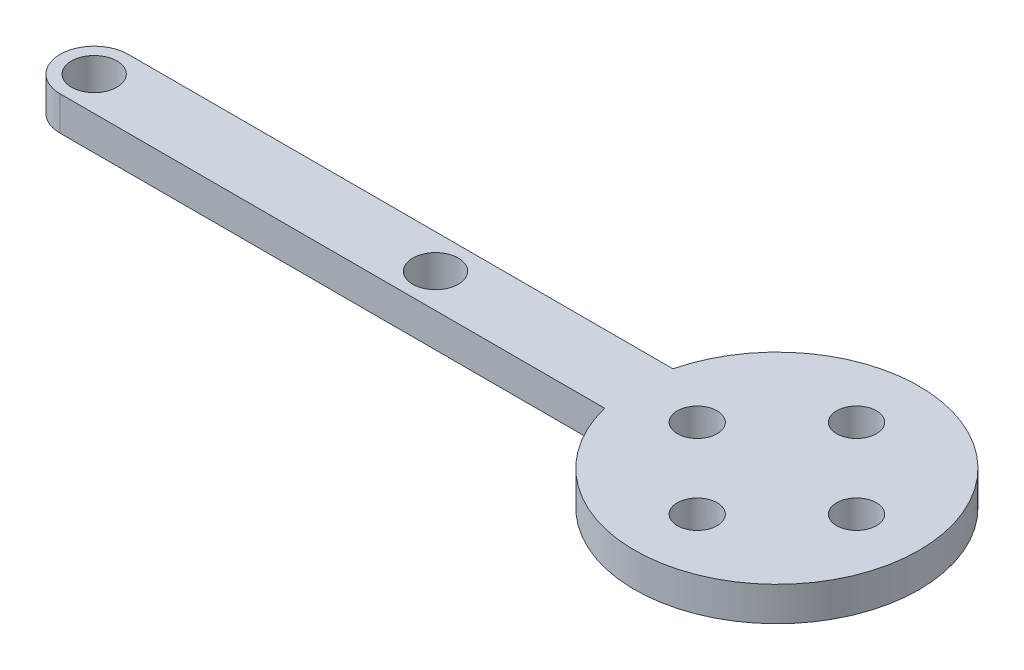
ISO-10303-21;
HEADER;
FILE_DESCRIPTION(('STEP AP214'),'2;1');
FILE_NAME('part.step','',(''),(''),'','','');
FILE_SCHEMA(('AUTOMOTIVE_DESIGN { 1 0 10303 214 1 1 1 1 }'));
ENDSEC;
DATA;
#1=APPLICATION_CONTEXT('core data for automotive mechanical design processes');
#2=APPLICATION_PROTOCOL_DEFINITION('international standard','automotive_design',2000,#1);
#3=PRODUCT_CONTEXT('',#1,'mechanical');
#4=PRODUCT('Part','Part','',(#3));
#5=PRODUCT_RELATED_PRODUCT_CATEGORY('part','',(#4));
#6=PRODUCT_DEFINITION_FORMATION('','',#4);
#7=PRODUCT_DEFINITION_CONTEXT('part definition',#1,'design');
#8=PRODUCT_DEFINITION('design','',#6,#7);
#9=PRODUCT_DEFINITION_SHAPE('','',#8);
#10=(LENGTH_UNIT() NAMED_UNIT(*) SI_UNIT(.MILLI.,.METRE.));
#11=(NAMED_UNIT(*) PLANE_ANGLE_UNIT() SI_UNIT($,.RADIAN.));
#12=(NAMED_UNIT(*) SI_UNIT($,.STERADIAN.) SOLID_ANGLE_UNIT());
#13=UNCERTAINTY_MEASURE_WITH_UNIT(LENGTH_MEASURE(1.E-05),#10,'distance_accuracy_value','');
#14=(GEOMETRIC_REPRESENTATION_CONTEXT(3) GLOBAL_UNCERTAINTY_ASSIGNED_CONTEXT((#13)) GLOBAL_UNIT_ASSIGNED_CONTEXT((#10,
#11,#12)) REPRESENTATION_CONTEXT('',''));
#15=CARTESIAN_POINT('',(0.,0.,0.));
#16=DIRECTION('',(0.,0.,1.));
#17=DIRECTION('',(1.,0.,0.));
#18=AXIS2_PLACEMENT_3D('',#15,#16,#17);
#19=CARTESIAN_POINT('',(-60.,3.,0.));
#20=DIRECTION('',(0.,1.,0.));
#21=DIRECTION('',(0.,0.,1.));
#22=AXIS2_PLACEMENT_3D('',#19,#20,#21);
#23=PLANE('',#22);
#24=CARTESIAN_POINT('',(-30.,3.,0.));
#25=DIRECTION('',(0.,1.,0.));
#26=DIRECTION('',(0.,0.,1.));
#27=AXIS2_PLACEMENT_3D('',#24,#25,#26);
#28=CIRCLE('',#27,2.);
#29=CARTESIAN_POINT('',(-30.,3.,2.00000000000001));
#30=VERTEX_POINT('',#29);
#31=EDGE_CURVE('E158',#30,#30,#28,.T.);
#32=ORIENTED_EDGE('',*,*,#31,.F.);
#33=EDGE_LOOP('',(#32));
#34=FACE_BOUND('',#33,.T.);
#35=CARTESIAN_POINT('',(0.,3.,7.));
#36=DIRECTION('',(0.,1.,0.));
#37=DIRECTION('',(0.,0.,1.));
#38=AXIS2_PLACEMENT_3D('',#35,#36,#37);
#39=CIRCLE('',#38,1.75);
#40=CARTESIAN_POINT('',(0.,3.,8.75));
#41=VERTEX_POINT('',#40);
#42=EDGE_CURVE('E142',#41,#41,#39,.T.);
#43=ORIENTED_EDGE('',*,*,#42,.F.);
#44=EDGE_LOOP('',(#43));
#45=FACE_BOUND('',#44,.T.);
#46=CARTESIAN_POINT('',(0.,3.,-7.));
#47=DIRECTION('',(0.,1.,0.));
#48=DIRECTION('',(0.,0.,1.));
#49=AXIS2_PLACEMENT_3D('',#46,#47,#48);
#50=CIRCLE('',#49,1.75);
#51=CARTESIAN_POINT('',(0.,3.,-5.25));
#52=VERTEX_POINT('',#51);
#53=EDGE_CURVE('E112',#52,#52,#50,.T.);
#54=ORIENTED_EDGE('',*,*,#53,.F.);
#55=EDGE_LOOP('',(#54));
#56=FACE_BOUND('',#55,.T.);
#57=CARTESIAN_POINT('',(-60.,3.,0.));
#58=DIRECTION('',(0.,1.,0.));
#59=DIRECTION('',(0.,0.,1.));
#60=AXIS2_PLACEMENT_3D('',#57,#58,#59);
#61=CIRCLE('',#60,3.);
#62=CARTESIAN_POINT('',(-60.,3.,-2.99999999999999));
#63=VERTEX_POINT('',#62);
#64=CARTESIAN_POINT('',(-60.,3.,3.00000000000001));
#65=VERTEX_POINT('',#64);
#66=EDGE_CURVE('E92',#63,#65,#61,.T.);
#67=ORIENTED_EDGE('',*,*,#66,.T.);
#68=DIRECTION('',(1.,0.,0.));
#69=VECTOR('',#68,1.);
#70=CARTESIAN_POINT('',(-12.1346610995116,3.,3.));
#71=LINE('',#70,#69);
#72=CARTESIAN_POINT('',(-12.1346610995116,3.,3.));
#73=VERTEX_POINT('',#72);
#74=EDGE_CURVE('E87',#65,#73,#71,.T.);
#75=ORIENTED_EDGE('',*,*,#74,.T.);
#76=CARTESIAN_POINT('',(0.,3.,0.));
#77=DIRECTION('',(0.,1.,0.));
#78=DIRECTION('',(0.,0.,1.));
#79=AXIS2_PLACEMENT_3D('',#76,#77,#78);
#80=CIRCLE('',#79,12.5);
#81=CARTESIAN_POINT('',(-12.1346610995116,3.,-3.));
#82=VERTEX_POINT('',#81);
#83=EDGE_CURVE('E90',#73,#82,#80,.T.);
#84=ORIENTED_EDGE('',*,*,#83,.T.);
#85=DIRECTION('',(-1.,0.,0.));
#86=VECTOR('',#85,1.);
#87=CARTESIAN_POINT('',(-12.1346610995116,3.,-3.));
#88=LINE('',#87,#86);
#89=EDGE_CURVE('E57',#82,#63,#88,.T.);
#90=ORIENTED_EDGE('',*,*,#89,.T.);
#91=EDGE_LOOP('',(#67,#75,#84,#90));
#92=FACE_BOUND('',#91,.T.);
#93=CARTESIAN_POINT('',(7.,3.,0.));
#94=DIRECTION('',(0.,1.,0.));
#95=DIRECTION('',(0.,0.,1.));
#96=AXIS2_PLACEMENT_3D('',#93,#94,#95);
#97=CIRCLE('',#96,1.75);
#98=CARTESIAN_POINT('',(7.,3.,1.75));
#99=VERTEX_POINT('',#98);
#100=EDGE_CURVE('E134',#99,#99,#97,.T.);
#101=ORIENTED_EDGE('',*,*,#100,.F.);
#102=EDGE_LOOP('',(#101));
#103=FACE_BOUND('',#102,.T.);
#104=CARTESIAN_POINT('',(-7.,3.,0.));
#105=DIRECTION('',(0.,1.,0.));
#106=DIRECTION('',(0.,0.,1.));
#107=AXIS2_PLACEMENT_3D('',#104,#105,#106);
#108=CIRCLE('',#107,1.75);
#109=CARTESIAN_POINT('',(-7.,3.,1.75));
#110=VERTEX_POINT('',#109);
#111=EDGE_CURVE('E150',#110,#110,#108,.T.);
#112=ORIENTED_EDGE('',*,*,#111,.F.);
#113=EDGE_LOOP('',(#112));
#114=FACE_BOUND('',#113,.T.);
#115=CARTESIAN_POINT('',(-60.,3.,0.));
#116=DIRECTION('',(0.,1.,0.));
#117=DIRECTION('',(0.,0.,1.));
#118=AXIS2_PLACEMENT_3D('',#115,#116,#117);
#119=CIRCLE('',#118,2.);
#120=CARTESIAN_POINT('',(-60.,3.,2.00000000000001));
#121=VERTEX_POINT('',#120);
#122=EDGE_CURVE('E166',#121,#121,#119,.T.);
#123=ORIENTED_EDGE('',*,*,#122,.F.);
#124=EDGE_LOOP('',(#123));
#125=FACE_BOUND('',#124,.T.);
#126=ADVANCED_FACE('F39',(#34,#45,#56,#92,#103,#114,#125),#23,.T.);
#127=CARTESIAN_POINT('',(-60.,0.,0.));
#128=DIRECTION('',(0.,1.,0.));
#129=DIRECTION('',(0.,0.,1.));
#130=AXIS2_PLACEMENT_3D('',#127,#128,#129);
#131=PLANE('',#130);
#132=CARTESIAN_POINT('',(-60.,0.,0.));
#133=DIRECTION('',(0.,1.,0.));
#134=DIRECTION('',(0.,0.,1.));
#135=AXIS2_PLACEMENT_3D('',#132,#133,#134);
#136=CIRCLE('',#135,3.);
#137=CARTESIAN_POINT('',(-60.,0.,-2.99999999999999));
#138=VERTEX_POINT('',#137);
#139=CARTESIAN_POINT('',(-60.,0.,3.00000000000001));
#140=VERTEX_POINT('',#139);
#141=EDGE_CURVE('E108',#138,#140,#136,.T.);
#142=ORIENTED_EDGE('',*,*,#141,.F.);
#143=DIRECTION('',(-1.,0.,0.));
#144=VECTOR('',#143,1.);
#145=CARTESIAN_POINT('',(-12.1346610995116,0.,-3.));
#146=LINE('',#145,#144);
#147=CARTESIAN_POINT('',(-12.1346610995116,0.,-3.));
#148=VERTEX_POINT('',#147);
#149=EDGE_CURVE('E80',#148,#138,#146,.T.);
#150=ORIENTED_EDGE('',*,*,#149,.F.);
#151=CARTESIAN_POINT('',(0.,0.,0.));
#152=DIRECTION('',(0.,1.,0.));
#153=DIRECTION('',(0.,0.,1.));
#154=AXIS2_PLACEMENT_3D('',#151,#152,#153);
#155=CIRCLE('',#154,12.5);
#156=CARTESIAN_POINT('',(-12.1346610995116,0.,3.));
#157=VERTEX_POINT('',#156);
#158=EDGE_CURVE('E74',#157,#148,#155,.T.);
#159=ORIENTED_EDGE('',*,*,#158,.F.);
#160=DIRECTION('',(1.,0.,0.));
#161=VECTOR('',#160,1.);
#162=CARTESIAN_POINT('',(-12.1346610995116,0.,3.));
#163=LINE('',#162,#161);
#164=EDGE_CURVE('E97',#140,#157,#163,.T.);
#165=ORIENTED_EDGE('',*,*,#164,.F.);
#166=EDGE_LOOP('',(#142,#150,#159,#165));
#167=FACE_BOUND('',#166,.T.);
#168=CARTESIAN_POINT('',(0.,0.,-7.));
#169=DIRECTION('',(0.,1.,0.));
#170=DIRECTION('',(0.,0.,1.));
#171=AXIS2_PLACEMENT_3D('',#168,#169,#170);
#172=CIRCLE('',#171,1.75);
#173=CARTESIAN_POINT('',(0.,0.,-5.25));
#174=VERTEX_POINT('',#173);
#175=EDGE_CURVE('E130',#174,#174,#172,.T.);
#176=ORIENTED_EDGE('',*,*,#175,.T.);
#177=EDGE_LOOP('',(#176));
#178=FACE_BOUND('',#177,.T.);
#179=CARTESIAN_POINT('',(7.,0.,0.));
#180=DIRECTION('',(0.,1.,0.));
#181=DIRECTION('',(0.,0.,1.));
#182=AXIS2_PLACEMENT_3D('',#179,#180,#181);
#183=CIRCLE('',#182,1.75);
#184=CARTESIAN_POINT('',(7.,0.,1.75));
#185=VERTEX_POINT('',#184);
#186=EDGE_CURVE('E138',#185,#185,#183,.T.);
#187=ORIENTED_EDGE('',*,*,#186,.T.);
#188=EDGE_LOOP('',(#187));
#189=FACE_BOUND('',#188,.T.);
#190=CARTESIAN_POINT('',(0.,0.,7.));
#191=DIRECTION('',(0.,1.,0.));
#192=DIRECTION('',(0.,0.,1.));
#193=AXIS2_PLACEMENT_3D('',#190,#191,#192);
#194=CIRCLE('',#193,1.75);
#195=CARTESIAN_POINT('',(0.,0.,8.75));
#196=VERTEX_POINT('',#195);
#197=EDGE_CURVE('E146',#196,#196,#194,.T.);
#198=ORIENTED_EDGE('',*,*,#197,.T.);
#199=EDGE_LOOP('',(#198));
#200=FACE_BOUND('',#199,.T.);
#201=CARTESIAN_POINT('',(-7.,0.,0.));
#202=DIRECTION('',(0.,1.,0.));
#203=DIRECTION('',(0.,0.,1.));
#204=AXIS2_PLACEMENT_3D('',#201,#202,#203);
#205=CIRCLE('',#204,1.75);
#206=CARTESIAN_POINT('',(-7.,0.,1.75));
#207=VERTEX_POINT('',#206);
#208=EDGE_CURVE('E154',#207,#207,#205,.T.);
#209=ORIENTED_EDGE('',*,*,#208,.T.);
#210=EDGE_LOOP('',(#209));
#211=FACE_BOUND('',#210,.T.);
#212=CARTESIAN_POINT('',(-30.,0.,0.));
#213=DIRECTION('',(0.,1.,0.));
#214=DIRECTION('',(0.,0.,1.));
#215=AXIS2_PLACEMENT_3D('',#212,#213,#214);
#216=CIRCLE('',#215,2.);
#217=CARTESIAN_POINT('',(-30.,0.,2.00000000000001));
#218=VERTEX_POINT('',#217);
#219=EDGE_CURVE('E162',#218,#218,#216,.T.);
#220=ORIENTED_EDGE('',*,*,#219,.T.);
#221=EDGE_LOOP('',(#220));
#222=FACE_BOUND('',#221,.T.);
#223=CARTESIAN_POINT('',(-60.,0.,0.));
#224=DIRECTION('',(0.,1.,0.));
#225=DIRECTION('',(0.,0.,1.));
#226=AXIS2_PLACEMENT_3D('',#223,#224,#225);
#227=CIRCLE('',#226,2.);
#228=CARTESIAN_POINT('',(-60.,0.,2.00000000000001));
#229=VERTEX_POINT('',#228);
#230=EDGE_CURVE('E170',#229,#229,#227,.T.);
#231=ORIENTED_EDGE('',*,*,#230,.T.);
#232=EDGE_LOOP('',(#231));
#233=FACE_BOUND('',#232,.T.);
#234=ADVANCED_FACE('F125',(#167,#178,#189,#200,#211,#222,#233),#131,.F.);
#235=CARTESIAN_POINT('',(-60.,3.,0.));
#236=DIRECTION('',(0.,-1.,0.));
#237=DIRECTION('',(0.,0.,-1.));
#238=AXIS2_PLACEMENT_3D('',#235,#236,#237);
#239=CYLINDRICAL_SURFACE('',#238,3.);
#240=ORIENTED_EDGE('',*,*,#141,.T.);
#241=DIRECTION('',(0.,-1.,0.));
#242=VECTOR('',#241,1.);
#243=CARTESIAN_POINT('',(-60.,3.,3.00000000000001));
#244=LINE('',#243,#242);
#245=EDGE_CURVE('E11',#65,#140,#244,.T.);
#246=ORIENTED_EDGE('',*,*,#245,.F.);
#247=ORIENTED_EDGE('',*,*,#66,.F.);
#248=DIRECTION('',(0.,-1.,0.));
#249=VECTOR('',#248,1.);
#250=CARTESIAN_POINT('',(-60.,3.,-2.99999999999999));
#251=LINE('',#250,#249);
#252=EDGE_CURVE('E104',#63,#138,#251,.T.);
#253=ORIENTED_EDGE('',*,*,#252,.T.);
#254=EDGE_LOOP('',(#240,#246,#247,#253));
#255=FACE_BOUND('',#254,.T.);
#256=ADVANCED_FACE('F41',(#255),#239,.T.);
#257=CARTESIAN_POINT('',(-12.1346610995116,3.,3.));
#258=DIRECTION('',(0.,0.,-1.));
#259=DIRECTION('',(-1.,0.,0.));
#260=AXIS2_PLACEMENT_3D('',#257,#258,#259);
#261=PLANE('',#260);
#262=ORIENTED_EDGE('',*,*,#164,.T.);
#263=DIRECTION('',(0.,-1.,0.));
#264=VECTOR('',#263,1.);
#265=CARTESIAN_POINT('',(-12.1346610995116,3.,3.));
#266=LINE('',#265,#264);
#267=EDGE_CURVE('E49',#73,#157,#266,.T.);
#268=ORIENTED_EDGE('',*,*,#267,.F.);
#269=ORIENTED_EDGE('',*,*,#74,.F.);
#270=ORIENTED_EDGE('',*,*,#245,.T.);
#271=EDGE_LOOP('',(#262,#268,#269,#270));
#272=FACE_BOUND('',#271,.T.);
#273=ADVANCED_FACE('F96',(#272),#261,.F.);
#274=CARTESIAN_POINT('',(0.,3.,0.));
#275=DIRECTION('',(0.,-1.,0.));
#276=DIRECTION('',(0.,0.,-1.));
#277=AXIS2_PLACEMENT_3D('',#274,#275,#276);
#278=CYLINDRICAL_SURFACE('',#277,12.5);
#279=ORIENTED_EDGE('',*,*,#158,.T.);
#280=DIRECTION('',(0.,-1.,0.));
#281=VECTOR('',#280,1.);
#282=CARTESIAN_POINT('',(-12.1346610995116,3.,-3.));
#283=LINE('',#282,#281);
#284=EDGE_CURVE('E99',#82,#148,#283,.T.);
#285=ORIENTED_EDGE('',*,*,#284,.F.);
#286=ORIENTED_EDGE('',*,*,#83,.F.);
#287=ORIENTED_EDGE('',*,*,#267,.T.);
#288=EDGE_LOOP('',(#279,#285,#286,#287));
#289=FACE_BOUND('',#288,.T.);
#290=ADVANCED_FACE('F100',(#289),#278,.T.);
#291=CARTESIAN_POINT('',(-12.1346610995116,3.,-3.));
#292=DIRECTION('',(0.,0.,1.));
#293=DIRECTION('',(1.,0.,0.));
#294=AXIS2_PLACEMENT_3D('',#291,#292,#293);
#295=PLANE('',#294);
#296=ORIENTED_EDGE('',*,*,#149,.T.);
#297=ORIENTED_EDGE('',*,*,#252,.F.);
#298=ORIENTED_EDGE('',*,*,#89,.F.);
#299=ORIENTED_EDGE('',*,*,#284,.T.);
#300=EDGE_LOOP('',(#296,#297,#298,#299));
#301=FACE_BOUND('',#300,.T.);
#302=ADVANCED_FACE('F122',(#301),#295,.F.);
#303=CARTESIAN_POINT('',(0.,3.,-7.));
#304=DIRECTION('',(0.,-1.,0.));
#305=DIRECTION('',(0.,0.,-1.));
#306=AXIS2_PLACEMENT_3D('',#303,#304,#305);
#307=CYLINDRICAL_SURFACE('',#306,1.75);
#308=ORIENTED_EDGE('',*,*,#53,.T.);
#309=EDGE_LOOP('',(#308));
#310=FACE_BOUND('',#309,.T.);
#311=ORIENTED_EDGE('',*,*,#175,.F.);
#312=EDGE_LOOP('',(#311));
#313=FACE_BOUND('',#312,.T.);
#314=ADVANCED_FACE('F191',(#310,#313),#307,.F.);
#315=CARTESIAN_POINT('',(7.,3.,0.));
#316=DIRECTION('',(0.,-1.,0.));
#317=DIRECTION('',(0.,0.,-1.));
#318=AXIS2_PLACEMENT_3D('',#315,#316,#317);
#319=CYLINDRICAL_SURFACE('',#318,1.75);
#320=ORIENTED_EDGE('',*,*,#100,.T.);
#321=EDGE_LOOP('',(#320));
#322=FACE_BOUND('',#321,.T.);
#323=ORIENTED_EDGE('',*,*,#186,.F.);
#324=EDGE_LOOP('',(#323));
#325=FACE_BOUND('',#324,.T.);
#326=ADVANCED_FACE('F237',(#322,#325),#319,.F.);
#327=CARTESIAN_POINT('',(0.,3.,7.));
#328=DIRECTION('',(0.,-1.,0.));
#329=DIRECTION('',(0.,0.,-1.));
#330=AXIS2_PLACEMENT_3D('',#327,#328,#329);
#331=CYLINDRICAL_SURFACE('',#330,1.75);
#332=ORIENTED_EDGE('',*,*,#42,.T.);
#333=EDGE_LOOP('',(#332));
#334=FACE_BOUND('',#333,.T.);
#335=ORIENTED_EDGE('',*,*,#197,.F.);
#336=EDGE_LOOP('',(#335));
#337=FACE_BOUND('',#336,.T.);
#338=ADVANCED_FACE('F245',(#334,#337),#331,.F.);
#339=CARTESIAN_POINT('',(-7.,3.,0.));
#340=DIRECTION('',(0.,-1.,0.));
#341=DIRECTION('',(0.,0.,-1.));
#342=AXIS2_PLACEMENT_3D('',#339,#340,#341);
#343=CYLINDRICAL_SURFACE('',#342,1.75);
#344=ORIENTED_EDGE('',*,*,#111,.T.);
#345=EDGE_LOOP('',(#344));
#346=FACE_BOUND('',#345,.T.);
#347=ORIENTED_EDGE('',*,*,#208,.F.);
#348=EDGE_LOOP('',(#347));
#349=FACE_BOUND('',#348,.T.);
#350=ADVANCED_FACE('F253',(#346,#349),#343,.F.);
#351=CARTESIAN_POINT('',(-30.,3.,0.));
#352=DIRECTION('',(0.,-1.,0.));
#353=DIRECTION('',(0.,0.,-1.));
#354=AXIS2_PLACEMENT_3D('',#351,#352,#353);
#355=CYLINDRICAL_SURFACE('',#354,2.);
#356=ORIENTED_EDGE('',*,*,#31,.T.);
#357=EDGE_LOOP('',(#356));
#358=FACE_BOUND('',#357,.T.);
#359=ORIENTED_EDGE('',*,*,#219,.F.);
#360=EDGE_LOOP('',(#359));
#361=FACE_BOUND('',#360,.T.);
#362=ADVANCED_FACE('F262',(#358,#361),#355,.F.);
#363=CARTESIAN_POINT('',(-60.,3.,0.));
#364=DIRECTION('',(0.,-1.,0.));
#365=DIRECTION('',(0.,0.,-1.));
#366=AXIS2_PLACEMENT_3D('',#363,#364,#365);
#367=CYLINDRICAL_SURFACE('',#366,2.);
#368=ORIENTED_EDGE('',*,*,#122,.T.);
#369=EDGE_LOOP('',(#368));
#370=FACE_BOUND('',#369,.T.);
#371=ORIENTED_EDGE('',*,*,#230,.F.);
#372=EDGE_LOOP('',(#371));
#373=FACE_BOUND('',#372,.T.);
#374=ADVANCED_FACE('F178',(#370,#373),#367,.F.);
#375=CLOSED_SHELL('',(#126,#234,#256,#273,#290,#302,#314,#326,#338,#350,#362,#374));
#376=MANIFOLD_SOLID_BREP('B2',#375);
#377=ADVANCED_BREP_SHAPE_REPRESENTATION('',(#18,#376),#14);
#378=SHAPE_DEFINITION_REPRESENTATION(#9,#377);
ENDSEC;
END-ISO-10303-21;
